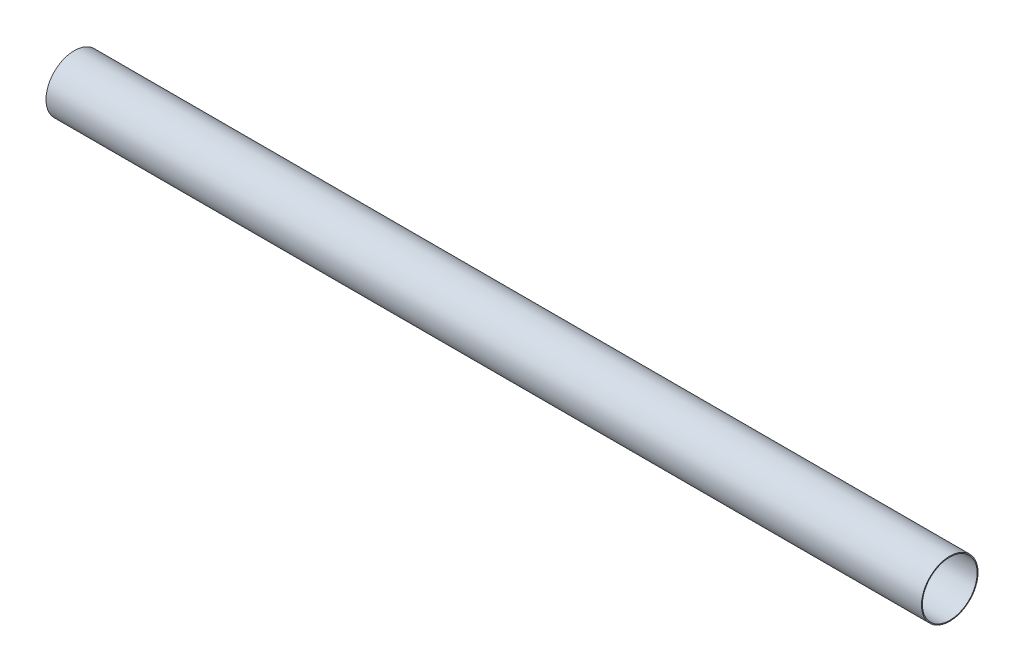
ISO-10303-21;
HEADER;
FILE_DESCRIPTION(('STEP AP214'),'2;1');
FILE_NAME('part.step','',(''),(''),'','','');
FILE_SCHEMA(('AUTOMOTIVE_DESIGN { 1 0 10303 214 1 1 1 1 }'));
ENDSEC;
DATA;
#1=APPLICATION_CONTEXT('core data for automotive mechanical design processes');
#2=APPLICATION_PROTOCOL_DEFINITION('international standard','automotive_design',2000,#1);
#3=PRODUCT_CONTEXT('',#1,'mechanical');
#4=PRODUCT('Part','Part','',(#3));
#5=PRODUCT_RELATED_PRODUCT_CATEGORY('part','',(#4));
#6=PRODUCT_DEFINITION_FORMATION('','',#4);
#7=PRODUCT_DEFINITION_CONTEXT('part definition',#1,'design');
#8=PRODUCT_DEFINITION('design','',#6,#7);
#9=PRODUCT_DEFINITION_SHAPE('','',#8);
#10=(LENGTH_UNIT() NAMED_UNIT(*) SI_UNIT(.MILLI.,.METRE.));
#11=(NAMED_UNIT(*) PLANE_ANGLE_UNIT() SI_UNIT($,.RADIAN.));
#12=(NAMED_UNIT(*) SI_UNIT($,.STERADIAN.) SOLID_ANGLE_UNIT());
#13=UNCERTAINTY_MEASURE_WITH_UNIT(LENGTH_MEASURE(1.E-05),#10,'distance_accuracy_value','');
#14=(GEOMETRIC_REPRESENTATION_CONTEXT(3) GLOBAL_UNCERTAINTY_ASSIGNED_CONTEXT((#13)) GLOBAL_UNIT_ASSIGNED_CONTEXT((#10,
#11,#12)) REPRESENTATION_CONTEXT('',''));
#15=CARTESIAN_POINT('',(0.,0.,0.));
#16=DIRECTION('',(0.,0.,1.));
#17=DIRECTION('',(1.,0.,0.));
#18=AXIS2_PLACEMENT_3D('',#15,#16,#17);
#19=CARTESIAN_POINT('',(2438.4,0.,0.));
#20=DIRECTION('',(1.,0.,0.));
#21=DIRECTION('',(0.,0.,-1.));
#22=AXIS2_PLACEMENT_3D('',#19,#20,#21);
#23=PLANE('',#22);
#24=CARTESIAN_POINT('',(2438.4,0.,0.));
#25=DIRECTION('',(1.,0.,0.));
#26=DIRECTION('',(0.,0.,-1.));
#27=AXIS2_PLACEMENT_3D('',#24,#25,#26);
#28=CIRCLE('',#27,78.74);
#29=CARTESIAN_POINT('',(2438.4,0.,78.74));
#30=VERTEX_POINT('',#29);
#31=EDGE_CURVE('E11',#30,#30,#28,.T.);
#32=ORIENTED_EDGE('',*,*,#31,.T.);
#33=EDGE_LOOP('',(#32));
#34=FACE_BOUND('',#33,.T.);
#35=CARTESIAN_POINT('',(2438.4,0.,0.));
#36=DIRECTION('',(1.,0.,0.));
#37=DIRECTION('',(0.,0.,-1.));
#38=AXIS2_PLACEMENT_3D('',#35,#36,#37);
#39=CIRCLE('',#38,76.2);
#40=CARTESIAN_POINT('',(2438.4,0.,76.2));
#41=VERTEX_POINT('',#40);
#42=EDGE_CURVE('E51',#41,#41,#39,.T.);
#43=ORIENTED_EDGE('',*,*,#42,.F.);
#44=EDGE_LOOP('',(#43));
#45=FACE_BOUND('',#44,.T.);
#46=ADVANCED_FACE('F40',(#34,#45),#23,.T.);
#47=CARTESIAN_POINT('',(0.,0.,0.));
#48=DIRECTION('',(1.,0.,0.));
#49=DIRECTION('',(0.,0.,-1.));
#50=AXIS2_PLACEMENT_3D('',#47,#48,#49);
#51=PLANE('',#50);
#52=CARTESIAN_POINT('',(0.,0.,0.));
#53=DIRECTION('',(1.,0.,0.));
#54=DIRECTION('',(0.,0.,-1.));
#55=AXIS2_PLACEMENT_3D('',#52,#53,#54);
#56=CIRCLE('',#55,78.74);
#57=CARTESIAN_POINT('',(0.,0.,78.74));
#58=VERTEX_POINT('',#57);
#59=EDGE_CURVE('E44',#58,#58,#56,.T.);
#60=ORIENTED_EDGE('',*,*,#59,.F.);
#61=EDGE_LOOP('',(#60));
#62=FACE_BOUND('',#61,.T.);
#63=CARTESIAN_POINT('',(0.,0.,0.));
#64=DIRECTION('',(1.,0.,0.));
#65=DIRECTION('',(0.,0.,-1.));
#66=AXIS2_PLACEMENT_3D('',#63,#64,#65);
#67=CIRCLE('',#66,76.2);
#68=CARTESIAN_POINT('',(0.,0.,76.2));
#69=VERTEX_POINT('',#68);
#70=EDGE_CURVE('E53',#69,#69,#67,.T.);
#71=ORIENTED_EDGE('',*,*,#70,.T.);
#72=EDGE_LOOP('',(#71));
#73=FACE_BOUND('',#72,.T.);
#74=ADVANCED_FACE('F63',(#62,#73),#51,.F.);
#75=CARTESIAN_POINT('',(2438.4,0.,0.));
#76=DIRECTION('',(-1.,0.,0.));
#77=DIRECTION('',(0.,0.,1.));
#78=AXIS2_PLACEMENT_3D('',#75,#76,#77);
#79=CYLINDRICAL_SURFACE('',#78,78.74);
#80=CARTESIAN_POINT('',(2438.4,0.,78.74));
#81=CARTESIAN_POINT('',(2413.,0.,78.74));
#82=CARTESIAN_POINT('',(2387.6,0.,78.74));
#83=CARTESIAN_POINT('',(2336.8,0.,78.74));
#84=CARTESIAN_POINT('',(2311.4,0.,78.74));
#85=CARTESIAN_POINT('',(2260.6,0.,78.74));
#86=CARTESIAN_POINT('',(2235.2,0.,78.74));
#87=CARTESIAN_POINT('',(2184.4,0.,78.74));
#88=CARTESIAN_POINT('',(2159.,0.,78.74));
#89=CARTESIAN_POINT('',(2108.2,0.,78.74));
#90=CARTESIAN_POINT('',(2082.8,0.,78.74));
#91=CARTESIAN_POINT('',(2032.,0.,78.74));
#92=CARTESIAN_POINT('',(2006.6,0.,78.74));
#93=CARTESIAN_POINT('',(1955.8,0.,78.74));
#94=CARTESIAN_POINT('',(1930.4,0.,78.74));
#95=CARTESIAN_POINT('',(1879.6,0.,78.74));
#96=CARTESIAN_POINT('',(1854.2,0.,78.74));
#97=CARTESIAN_POINT('',(1803.4,0.,78.74));
#98=CARTESIAN_POINT('',(1778.,0.,78.74));
#99=CARTESIAN_POINT('',(1727.2,0.,78.74));
#100=CARTESIAN_POINT('',(1701.8,0.,78.74));
#101=CARTESIAN_POINT('',(1651.,0.,78.74));
#102=CARTESIAN_POINT('',(1625.6,0.,78.74));
#103=CARTESIAN_POINT('',(1574.8,0.,78.74));
#104=CARTESIAN_POINT('',(1549.4,0.,78.74));
#105=CARTESIAN_POINT('',(1498.6,0.,78.74));
#106=CARTESIAN_POINT('',(1473.2,0.,78.74));
#107=CARTESIAN_POINT('',(1422.4,0.,78.74));
#108=CARTESIAN_POINT('',(1397.,0.,78.74));
#109=CARTESIAN_POINT('',(1346.2,0.,78.74));
#110=CARTESIAN_POINT('',(1320.8,0.,78.74));
#111=CARTESIAN_POINT('',(1270.,0.,78.74));
#112=CARTESIAN_POINT('',(1244.6,0.,78.74));
#113=CARTESIAN_POINT('',(1193.8,0.,78.74));
#114=CARTESIAN_POINT('',(1168.4,0.,78.74));
#115=CARTESIAN_POINT('',(1117.6,0.,78.74));
#116=CARTESIAN_POINT('',(1092.2,0.,78.74));
#117=CARTESIAN_POINT('',(1041.4,0.,78.74));
#118=CARTESIAN_POINT('',(1016.,0.,78.74));
#119=CARTESIAN_POINT('',(965.2,0.,78.74));
#120=CARTESIAN_POINT('',(939.8,0.,78.74));
#121=CARTESIAN_POINT('',(889.,0.,78.74));
#122=CARTESIAN_POINT('',(863.6,0.,78.74));
#123=CARTESIAN_POINT('',(812.8,0.,78.74));
#124=CARTESIAN_POINT('',(787.4,0.,78.74));
#125=CARTESIAN_POINT('',(736.6,0.,78.74));
#126=CARTESIAN_POINT('',(711.2,0.,78.74));
#127=CARTESIAN_POINT('',(660.4,0.,78.74));
#128=CARTESIAN_POINT('',(635.,0.,78.74));
#129=CARTESIAN_POINT('',(584.2,0.,78.74));
#130=CARTESIAN_POINT('',(558.8,0.,78.74));
#131=CARTESIAN_POINT('',(508.,0.,78.74));
#132=CARTESIAN_POINT('',(482.6,0.,78.74));
#133=CARTESIAN_POINT('',(431.8,0.,78.74));
#134=CARTESIAN_POINT('',(406.4,0.,78.74));
#135=CARTESIAN_POINT('',(355.6,0.,78.74));
#136=CARTESIAN_POINT('',(330.2,0.,78.74));
#137=CARTESIAN_POINT('',(279.4,0.,78.74));
#138=CARTESIAN_POINT('',(254.,0.,78.74));
#139=CARTESIAN_POINT('',(203.2,0.,78.74));
#140=CARTESIAN_POINT('',(177.8,0.,78.74));
#141=CARTESIAN_POINT('',(127.,0.,78.74));
#142=CARTESIAN_POINT('',(101.6,0.,78.74));
#143=CARTESIAN_POINT('',(50.8,0.,78.74));
#144=CARTESIAN_POINT('',(25.4,0.,78.74));
#145=CARTESIAN_POINT('',(0.,0.,78.74));
#146=B_SPLINE_CURVE_WITH_KNOTS('',3,(#80,#81,#82,#83,#84,#85,#86,#87,#88,#89,#90,#91,#92,#93,
#94,#95,#96,#97,#98,#99,#100,#101,#102,#103,#104,#105,#106,#107,#108,#109,#110,#111,#112,#113,
#114,#115,#116,#117,#118,#119,#120,#121,#122,#123,#124,#125,#126,#127,#128,#129,#130,#131,#132,
#133,#134,#135,#136,#137,#138,#139,#140,#141,#142,#143,#144,#145),.UNSPECIFIED.,.F.,.F.,(4,2,2,
2,2,2,2,2,2,2,2,2,2,2,2,2,2,2,2,2,2,2,2,2,2,2,2,2,2,2,2,2,4),(0.,76.1999999999996,152.4,228.6,
304.8,381.,457.2,533.4,609.6,685.8,762.,838.2,914.4,990.6,1066.8,1143.,1219.2,1295.4,1371.6,
1447.8,1524.,1600.2,1676.4,1752.6,1828.8,1905.,1981.2,2057.4,2133.6,2209.8,2286.,2362.2,2438.4),.UNSPECIFIED.);
#147=EDGE_CURVE('BSEAM42',#30,#58,#146,.T.);
#148=ORIENTED_EDGE('',*,*,#31,.F.);
#149=ORIENTED_EDGE('',*,*,#59,.T.);
#150=ORIENTED_EDGE('',*,*,#147,.T.);
#151=ORIENTED_EDGE('',*,*,#147,.F.);
#152=EDGE_LOOP('',(#148,#150,#149,#151));
#153=FACE_BOUND('',#152,.T.);
#154=ADVANCED_FACE('F42',(#153),#79,.T.);
#155=CARTESIAN_POINT('',(2438.4,0.,0.));
#156=DIRECTION('',(-1.,0.,0.));
#157=DIRECTION('',(0.,0.,1.));
#158=AXIS2_PLACEMENT_3D('',#155,#156,#157);
#159=CYLINDRICAL_SURFACE('',#158,76.2);
#160=CARTESIAN_POINT('',(2438.4,0.,76.2));
#161=CARTESIAN_POINT('',(2413.,0.,76.2));
#162=CARTESIAN_POINT('',(2387.6,0.,76.2));
#163=CARTESIAN_POINT('',(2336.8,0.,76.2));
#164=CARTESIAN_POINT('',(2311.4,0.,76.2));
#165=CARTESIAN_POINT('',(2260.6,0.,76.2));
#166=CARTESIAN_POINT('',(2235.2,0.,76.2));
#167=CARTESIAN_POINT('',(2184.4,0.,76.2));
#168=CARTESIAN_POINT('',(2159.,0.,76.2));
#169=CARTESIAN_POINT('',(2108.2,0.,76.2));
#170=CARTESIAN_POINT('',(2082.8,0.,76.2));
#171=CARTESIAN_POINT('',(2032.,0.,76.2));
#172=CARTESIAN_POINT('',(2006.6,0.,76.2));
#173=CARTESIAN_POINT('',(1955.8,0.,76.2));
#174=CARTESIAN_POINT('',(1930.4,0.,76.2));
#175=CARTESIAN_POINT('',(1879.6,0.,76.2));
#176=CARTESIAN_POINT('',(1854.2,0.,76.2));
#177=CARTESIAN_POINT('',(1803.4,0.,76.2));
#178=CARTESIAN_POINT('',(1778.,0.,76.2));
#179=CARTESIAN_POINT('',(1727.2,0.,76.2));
#180=CARTESIAN_POINT('',(1701.8,0.,76.2));
#181=CARTESIAN_POINT('',(1651.,0.,76.2));
#182=CARTESIAN_POINT('',(1625.6,0.,76.2));
#183=CARTESIAN_POINT('',(1574.8,0.,76.2));
#184=CARTESIAN_POINT('',(1549.4,0.,76.2));
#185=CARTESIAN_POINT('',(1498.6,0.,76.2));
#186=CARTESIAN_POINT('',(1473.2,0.,76.2));
#187=CARTESIAN_POINT('',(1422.4,0.,76.2));
#188=CARTESIAN_POINT('',(1397.,0.,76.2));
#189=CARTESIAN_POINT('',(1346.2,0.,76.2));
#190=CARTESIAN_POINT('',(1320.8,0.,76.2));
#191=CARTESIAN_POINT('',(1270.,0.,76.2));
#192=CARTESIAN_POINT('',(1244.6,0.,76.2));
#193=CARTESIAN_POINT('',(1193.8,0.,76.2));
#194=CARTESIAN_POINT('',(1168.4,0.,76.2));
#195=CARTESIAN_POINT('',(1117.6,0.,76.2));
#196=CARTESIAN_POINT('',(1092.2,0.,76.2));
#197=CARTESIAN_POINT('',(1041.4,0.,76.2));
#198=CARTESIAN_POINT('',(1016.,0.,76.2));
#199=CARTESIAN_POINT('',(965.2,0.,76.2));
#200=CARTESIAN_POINT('',(939.8,0.,76.2));
#201=CARTESIAN_POINT('',(889.,0.,76.2));
#202=CARTESIAN_POINT('',(863.6,0.,76.2));
#203=CARTESIAN_POINT('',(812.8,0.,76.2));
#204=CARTESIAN_POINT('',(787.4,0.,76.2));
#205=CARTESIAN_POINT('',(736.6,0.,76.2));
#206=CARTESIAN_POINT('',(711.2,0.,76.2));
#207=CARTESIAN_POINT('',(660.4,0.,76.2));
#208=CARTESIAN_POINT('',(635.,0.,76.2));
#209=CARTESIAN_POINT('',(584.2,0.,76.2));
#210=CARTESIAN_POINT('',(558.8,0.,76.2));
#211=CARTESIAN_POINT('',(508.,0.,76.2));
#212=CARTESIAN_POINT('',(482.6,0.,76.2));
#213=CARTESIAN_POINT('',(431.8,0.,76.2));
#214=CARTESIAN_POINT('',(406.4,0.,76.2));
#215=CARTESIAN_POINT('',(355.6,0.,76.2));
#216=CARTESIAN_POINT('',(330.2,0.,76.2));
#217=CARTESIAN_POINT('',(279.4,0.,76.2));
#218=CARTESIAN_POINT('',(254.,0.,76.2));
#219=CARTESIAN_POINT('',(203.2,0.,76.2));
#220=CARTESIAN_POINT('',(177.8,0.,76.2));
#221=CARTESIAN_POINT('',(127.,0.,76.2));
#222=CARTESIAN_POINT('',(101.6,0.,76.2));
#223=CARTESIAN_POINT('',(50.8,0.,76.2));
#224=CARTESIAN_POINT('',(25.4,0.,76.2));
#225=CARTESIAN_POINT('',(0.,0.,76.2));
#226=B_SPLINE_CURVE_WITH_KNOTS('',3,(#160,#161,#162,#163,#164,#165,#166,#167,#168,#169,#170,
#171,#172,#173,#174,#175,#176,#177,#178,#179,#180,#181,#182,#183,#184,#185,#186,#187,#188,#189,
#190,#191,#192,#193,#194,#195,#196,#197,#198,#199,#200,#201,#202,#203,#204,#205,#206,#207,#208,
#209,#210,#211,#212,#213,#214,#215,#216,#217,#218,#219,#220,#221,#222,#223,#224,#225),
.UNSPECIFIED.,.F.,.F.,(4,2,2,2,2,2,2,2,2,2,2,2,2,2,2,2,2,2,2,2,2,2,2,2,2,2,2,2,2,2,2,2,4),(0.,
76.1999999999996,152.4,228.6,304.8,381.,457.2,533.4,609.6,685.8,762.,838.2,914.4,990.6,1066.8,
1143.,1219.2,1295.4,1371.6,1447.8,1524.,1600.2,1676.4,1752.6,1828.8,1905.,1981.2,2057.4,2133.6,
2209.8,2286.,2362.2,2438.4),.UNSPECIFIED.);
#227=EDGE_CURVE('BSEAM59',#41,#69,#226,.T.);
#228=ORIENTED_EDGE('',*,*,#42,.T.);
#229=ORIENTED_EDGE('',*,*,#70,.F.);
#230=ORIENTED_EDGE('',*,*,#227,.T.);
#231=ORIENTED_EDGE('',*,*,#227,.F.);
#232=EDGE_LOOP('',(#228,#230,#229,#231));
#233=FACE_BOUND('',#232,.T.);
#234=ADVANCED_FACE('F59',(#233),#159,.F.);
#235=CLOSED_SHELL('',(#46,#74,#154,#234));
#236=MANIFOLD_SOLID_BREP('B2',#235);
#237=ADVANCED_BREP_SHAPE_REPRESENTATION('',(#18,#236),#14);
#238=SHAPE_DEFINITION_REPRESENTATION(#9,#237);
ENDSEC;
END-ISO-10303-21;
